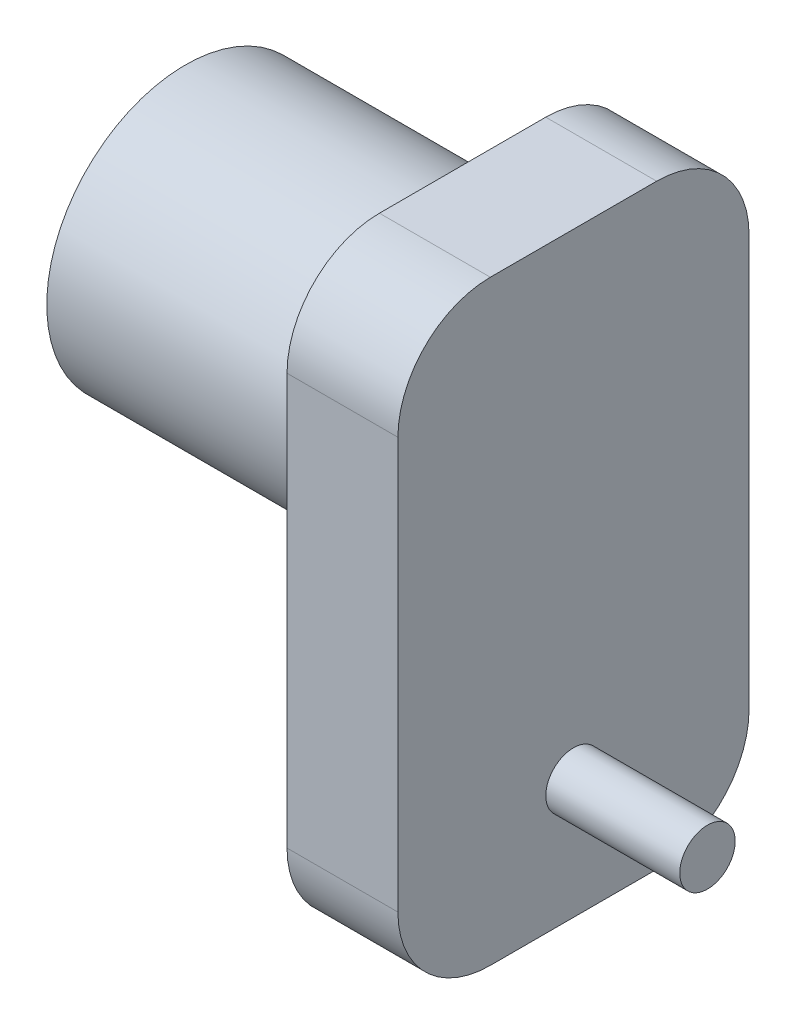
ISO-10303-21;
HEADER;
FILE_DESCRIPTION(('STEP AP214'),'2;1');
FILE_NAME('part.step','',(''),(''),'','','');
FILE_SCHEMA(('AUTOMOTIVE_DESIGN { 1 0 10303 214 1 1 1 1 }'));
ENDSEC;
DATA;
#1=APPLICATION_CONTEXT('core data for automotive mechanical design processes');
#2=APPLICATION_PROTOCOL_DEFINITION('international standard','automotive_design',2000,#1);
#3=PRODUCT_CONTEXT('',#1,'mechanical');
#4=PRODUCT('Part','Part','',(#3));
#5=PRODUCT_RELATED_PRODUCT_CATEGORY('part','',(#4));
#6=PRODUCT_DEFINITION_FORMATION('','',#4);
#7=PRODUCT_DEFINITION_CONTEXT('part definition',#1,'design');
#8=PRODUCT_DEFINITION('design','',#6,#7);
#9=PRODUCT_DEFINITION_SHAPE('','',#8);
#10=(LENGTH_UNIT() NAMED_UNIT(*) SI_UNIT(.MILLI.,.METRE.));
#11=(NAMED_UNIT(*) PLANE_ANGLE_UNIT() SI_UNIT($,.RADIAN.));
#12=(NAMED_UNIT(*) SI_UNIT($,.STERADIAN.) SOLID_ANGLE_UNIT());
#13=UNCERTAINTY_MEASURE_WITH_UNIT(LENGTH_MEASURE(1.E-05),#10,'distance_accuracy_value','');
#14=(GEOMETRIC_REPRESENTATION_CONTEXT(3) GLOBAL_UNCERTAINTY_ASSIGNED_CONTEXT((#13)) GLOBAL_UNIT_ASSIGNED_CONTEXT((#10,
#11,#12)) REPRESENTATION_CONTEXT('',''));
#15=CARTESIAN_POINT('',(0.,0.,0.));
#16=DIRECTION('',(0.,0.,1.));
#17=DIRECTION('',(1.,0.,0.));
#18=AXIS2_PLACEMENT_3D('',#15,#16,#17);
#19=CARTESIAN_POINT('',(-30.,0.,0.));
#20=DIRECTION('',(1.,0.,0.));
#21=DIRECTION('',(0.,0.,-1.));
#22=AXIS2_PLACEMENT_3D('',#19,#20,#21);
#23=CYLINDRICAL_SURFACE('',#22,15.);
#24=CARTESIAN_POINT('',(-30.,0.,0.));
#25=DIRECTION('',(1.,0.,0.));
#26=DIRECTION('',(0.,0.,-1.));
#27=AXIS2_PLACEMENT_3D('',#24,#25,#26);
#28=CIRCLE('',#27,15.);
#29=CARTESIAN_POINT('',(-30.,0.,-15.));
#30=VERTEX_POINT('',#29);
#31=EDGE_CURVE('E11',#30,#30,#28,.T.);
#32=ORIENTED_EDGE('',*,*,#31,.T.);
#33=EDGE_LOOP('',(#32));
#34=FACE_BOUND('',#33,.T.);
#35=CARTESIAN_POINT('',(0.,0.,0.));
#36=DIRECTION('',(1.,0.,0.));
#37=DIRECTION('',(0.,0.,-1.));
#38=AXIS2_PLACEMENT_3D('',#35,#36,#37);
#39=CIRCLE('',#38,15.);
#40=CARTESIAN_POINT('',(0.,0.,-15.));
#41=VERTEX_POINT('',#40);
#42=EDGE_CURVE('E37',#41,#41,#39,.T.);
#43=ORIENTED_EDGE('',*,*,#42,.F.);
#44=EDGE_LOOP('',(#43));
#45=FACE_BOUND('',#44,.T.);
#46=ADVANCED_FACE('F34',(#34,#45),#23,.T.);
#47=CARTESIAN_POINT('',(-30.,0.,0.));
#48=DIRECTION('',(1.,0.,0.));
#49=DIRECTION('',(0.,0.,-1.));
#50=AXIS2_PLACEMENT_3D('',#47,#48,#49);
#51=PLANE('',#50);
#52=ORIENTED_EDGE('',*,*,#31,.F.);
#53=EDGE_LOOP('',(#52));
#54=FACE_BOUND('',#53,.T.);
#55=ADVANCED_FACE('F211',(#54),#51,.F.);
#56=CARTESIAN_POINT('',(12.,20.6,8.99999999999993));
#57=DIRECTION('',(0.,1.,0.));
#58=DIRECTION('',(0.,0.,1.));
#59=AXIS2_PLACEMENT_3D('',#56,#57,#58);
#60=PLANE('',#59);
#61=DIRECTION('',(0.,0.,-1.));
#62=VECTOR('',#61,1.);
#63=CARTESIAN_POINT('',(0.,20.6,8.99999999999993));
#64=LINE('',#63,#62);
#65=CARTESIAN_POINT('',(0.,20.6,8.99999999999993));
#66=VERTEX_POINT('',#65);
#67=CARTESIAN_POINT('',(0.,20.6,-8.99999999999993));
#68=VERTEX_POINT('',#67);
#69=EDGE_CURVE('E134',#66,#68,#64,.T.);
#70=ORIENTED_EDGE('',*,*,#69,.F.);
#71=DIRECTION('',(-1.,0.,0.));
#72=VECTOR('',#71,1.);
#73=CARTESIAN_POINT('',(12.,20.6,8.99999999999993));
#74=LINE('',#73,#72);
#75=CARTESIAN_POINT('',(12.,20.6,8.99999999999993));
#76=VERTEX_POINT('',#75);
#77=EDGE_CURVE('E50',#76,#66,#74,.T.);
#78=ORIENTED_EDGE('',*,*,#77,.F.);
#79=DIRECTION('',(0.,0.,-1.));
#80=VECTOR('',#79,1.);
#81=CARTESIAN_POINT('',(12.,20.6,8.99999999999993));
#82=LINE('',#81,#80);
#83=CARTESIAN_POINT('',(12.,20.6,-8.99999999999993));
#84=VERTEX_POINT('',#83);
#85=EDGE_CURVE('E154',#76,#84,#82,.T.);
#86=ORIENTED_EDGE('',*,*,#85,.T.);
#87=DIRECTION('',(-1.,0.,0.));
#88=VECTOR('',#87,1.);
#89=CARTESIAN_POINT('',(12.,20.6,-8.99999999999993));
#90=LINE('',#89,#88);
#91=EDGE_CURVE('E133',#84,#68,#90,.T.);
#92=ORIENTED_EDGE('',*,*,#91,.T.);
#93=EDGE_LOOP('',(#70,#78,#86,#92));
#94=FACE_BOUND('',#93,.T.);
#95=ADVANCED_FACE('F164',(#94),#60,.T.);
#96=CARTESIAN_POINT('',(12.,10.6,9.00000000000001));
#97=DIRECTION('',(-1.,0.,0.));
#98=DIRECTION('',(0.,0.,1.));
#99=AXIS2_PLACEMENT_3D('',#96,#97,#98);
#100=CYLINDRICAL_SURFACE('',#99,10.);
#101=CARTESIAN_POINT('',(0.,10.6,9.00000000000001));
#102=DIRECTION('',(1.,0.,0.));
#103=DIRECTION('',(0.,0.,-1.));
#104=AXIS2_PLACEMENT_3D('',#101,#102,#103);
#105=CIRCLE('',#104,10.);
#106=CARTESIAN_POINT('',(0.,10.5999999999999,19.));
#107=VERTEX_POINT('',#106);
#108=EDGE_CURVE('E79',#66,#107,#105,.T.);
#109=ORIENTED_EDGE('',*,*,#108,.T.);
#110=DIRECTION('',(-1.,0.,0.));
#111=VECTOR('',#110,1.);
#112=CARTESIAN_POINT('',(12.,10.5999999999999,19.));
#113=LINE('',#112,#111);
#114=CARTESIAN_POINT('',(12.,10.5999999999999,19.));
#115=VERTEX_POINT('',#114);
#116=EDGE_CURVE('E121',#115,#107,#113,.T.);
#117=ORIENTED_EDGE('',*,*,#116,.F.);
#118=CARTESIAN_POINT('',(12.,10.6,9.00000000000001));
#119=DIRECTION('',(1.,0.,0.));
#120=DIRECTION('',(0.,0.,-1.));
#121=AXIS2_PLACEMENT_3D('',#118,#119,#120);
#122=CIRCLE('',#121,10.);
#123=EDGE_CURVE('E110',#76,#115,#122,.T.);
#124=ORIENTED_EDGE('',*,*,#123,.F.);
#125=ORIENTED_EDGE('',*,*,#77,.T.);
#126=EDGE_LOOP('',(#109,#117,#124,#125));
#127=FACE_BOUND('',#126,.T.);
#128=ADVANCED_FACE('F224',(#127),#100,.T.);
#129=CARTESIAN_POINT('',(12.,10.5999999999999,19.));
#130=DIRECTION('',(0.,0.,-1.));
#131=DIRECTION('',(0.,1.,0.));
#132=AXIS2_PLACEMENT_3D('',#129,#130,#131);
#133=PLANE('',#132);
#134=DIRECTION('',(0.,-1.,0.));
#135=VECTOR('',#134,1.);
#136=CARTESIAN_POINT('',(0.,10.5999999999999,19.));
#137=LINE('',#136,#135);
#138=CARTESIAN_POINT('',(0.,-33.8999999999999,19.));
#139=VERTEX_POINT('',#138);
#140=EDGE_CURVE('E117',#107,#139,#137,.T.);
#141=ORIENTED_EDGE('',*,*,#140,.T.);
#142=DIRECTION('',(-1.,0.,0.));
#143=VECTOR('',#142,1.);
#144=CARTESIAN_POINT('',(12.,-33.8999999999999,19.));
#145=LINE('',#144,#143);
#146=CARTESIAN_POINT('',(12.,-33.8999999999999,19.));
#147=VERTEX_POINT('',#146);
#148=EDGE_CURVE('E114',#147,#139,#145,.T.);
#149=ORIENTED_EDGE('',*,*,#148,.F.);
#150=DIRECTION('',(0.,-1.,0.));
#151=VECTOR('',#150,1.);
#152=CARTESIAN_POINT('',(12.,10.5999999999999,19.));
#153=LINE('',#152,#151);
#154=EDGE_CURVE('E105',#115,#147,#153,.T.);
#155=ORIENTED_EDGE('',*,*,#154,.F.);
#156=ORIENTED_EDGE('',*,*,#116,.T.);
#157=EDGE_LOOP('',(#141,#149,#155,#156));
#158=FACE_BOUND('',#157,.T.);
#159=ADVANCED_FACE('F115',(#158),#133,.F.);
#160=CARTESIAN_POINT('',(12.,-33.9,9.));
#161=DIRECTION('',(-1.,0.,0.));
#162=DIRECTION('',(0.,0.,1.));
#163=AXIS2_PLACEMENT_3D('',#160,#161,#162);
#164=CYLINDRICAL_SURFACE('',#163,10.);
#165=CARTESIAN_POINT('',(0.,-33.9,9.));
#166=DIRECTION('',(-1.,0.,0.));
#167=DIRECTION('',(0.,0.,1.));
#168=AXIS2_PLACEMENT_3D('',#165,#166,#167);
#169=CIRCLE('',#168,10.);
#170=CARTESIAN_POINT('',(0.,-43.9,8.99999999999993));
#171=VERTEX_POINT('',#170);
#172=EDGE_CURVE('E150',#171,#139,#169,.T.);
#173=ORIENTED_EDGE('',*,*,#172,.F.);
#174=DIRECTION('',(-1.,0.,0.));
#175=VECTOR('',#174,1.);
#176=CARTESIAN_POINT('',(12.,-43.9,8.99999999999993));
#177=LINE('',#176,#175);
#178=CARTESIAN_POINT('',(12.,-43.9,8.99999999999993));
#179=VERTEX_POINT('',#178);
#180=EDGE_CURVE('E122',#179,#171,#177,.T.);
#181=ORIENTED_EDGE('',*,*,#180,.F.);
#182=CARTESIAN_POINT('',(12.,-33.9,9.));
#183=DIRECTION('',(-1.,0.,0.));
#184=DIRECTION('',(0.,0.,1.));
#185=AXIS2_PLACEMENT_3D('',#182,#183,#184);
#186=CIRCLE('',#185,10.);
#187=EDGE_CURVE('E109',#179,#147,#186,.T.);
#188=ORIENTED_EDGE('',*,*,#187,.T.);
#189=ORIENTED_EDGE('',*,*,#148,.T.);
#190=EDGE_LOOP('',(#173,#181,#188,#189));
#191=FACE_BOUND('',#190,.T.);
#192=ADVANCED_FACE('F124',(#191),#164,.T.);
#193=CARTESIAN_POINT('',(12.,-43.9,8.99999999999993));
#194=DIRECTION('',(0.,1.,0.));
#195=DIRECTION('',(0.,0.,1.));
#196=AXIS2_PLACEMENT_3D('',#193,#194,#195);
#197=PLANE('',#196);
#198=DIRECTION('',(0.,0.,-1.));
#199=VECTOR('',#198,1.);
#200=CARTESIAN_POINT('',(0.,-43.9,8.99999999999993));
#201=LINE('',#200,#199);
#202=CARTESIAN_POINT('',(0.,-43.9,-8.99999999999993));
#203=VERTEX_POINT('',#202);
#204=EDGE_CURVE('E147',#171,#203,#201,.T.);
#205=ORIENTED_EDGE('',*,*,#204,.T.);
#206=DIRECTION('',(-1.,0.,0.));
#207=VECTOR('',#206,1.);
#208=CARTESIAN_POINT('',(12.,-43.9,-8.99999999999993));
#209=LINE('',#208,#207);
#210=CARTESIAN_POINT('',(12.,-43.9,-8.99999999999993));
#211=VERTEX_POINT('',#210);
#212=EDGE_CURVE('E158',#211,#203,#209,.T.);
#213=ORIENTED_EDGE('',*,*,#212,.F.);
#214=DIRECTION('',(0.,0.,-1.));
#215=VECTOR('',#214,1.);
#216=CARTESIAN_POINT('',(12.,-43.9,8.99999999999993));
#217=LINE('',#216,#215);
#218=EDGE_CURVE('E126',#179,#211,#217,.T.);
#219=ORIENTED_EDGE('',*,*,#218,.F.);
#220=ORIENTED_EDGE('',*,*,#180,.T.);
#221=EDGE_LOOP('',(#205,#213,#219,#220));
#222=FACE_BOUND('',#221,.T.);
#223=ADVANCED_FACE('F175',(#222),#197,.F.);
#224=CARTESIAN_POINT('',(12.,-33.9,-9.));
#225=DIRECTION('',(-1.,0.,0.));
#226=DIRECTION('',(0.,0.,1.));
#227=AXIS2_PLACEMENT_3D('',#224,#225,#226);
#228=CYLINDRICAL_SURFACE('',#227,10.);
#229=CARTESIAN_POINT('',(0.,-33.9,-9.));
#230=DIRECTION('',(-1.,0.,0.));
#231=DIRECTION('',(0.,0.,1.));
#232=AXIS2_PLACEMENT_3D('',#229,#230,#231);
#233=CIRCLE('',#232,10.);
#234=CARTESIAN_POINT('',(0.,-33.8999999999999,-19.));
#235=VERTEX_POINT('',#234);
#236=EDGE_CURVE('E144',#235,#203,#233,.T.);
#237=ORIENTED_EDGE('',*,*,#236,.F.);
#238=DIRECTION('',(-1.,0.,0.));
#239=VECTOR('',#238,1.);
#240=CARTESIAN_POINT('',(12.,-33.8999999999999,-19.));
#241=LINE('',#240,#239);
#242=CARTESIAN_POINT('',(12.,-33.8999999999999,-19.));
#243=VERTEX_POINT('',#242);
#244=EDGE_CURVE('E160',#243,#235,#241,.T.);
#245=ORIENTED_EDGE('',*,*,#244,.F.);
#246=CARTESIAN_POINT('',(12.,-33.9,-9.));
#247=DIRECTION('',(-1.,0.,0.));
#248=DIRECTION('',(0.,0.,1.));
#249=AXIS2_PLACEMENT_3D('',#246,#247,#248);
#250=CIRCLE('',#249,10.);
#251=EDGE_CURVE('E128',#243,#211,#250,.T.);
#252=ORIENTED_EDGE('',*,*,#251,.T.);
#253=ORIENTED_EDGE('',*,*,#212,.T.);
#254=EDGE_LOOP('',(#237,#245,#252,#253));
#255=FACE_BOUND('',#254,.T.);
#256=ADVANCED_FACE('F229',(#255),#228,.T.);
#257=CARTESIAN_POINT('',(12.,10.5999999999999,-19.));
#258=DIRECTION('',(0.,0.,-1.));
#259=DIRECTION('',(0.,1.,0.));
#260=AXIS2_PLACEMENT_3D('',#257,#258,#259);
#261=PLANE('',#260);
#262=DIRECTION('',(0.,-1.,0.));
#263=VECTOR('',#262,1.);
#264=CARTESIAN_POINT('',(0.,10.5999999999999,-19.));
#265=LINE('',#264,#263);
#266=CARTESIAN_POINT('',(0.,10.5999999999999,-19.));
#267=VERTEX_POINT('',#266);
#268=EDGE_CURVE('E141',#267,#235,#265,.T.);
#269=ORIENTED_EDGE('',*,*,#268,.F.);
#270=DIRECTION('',(-1.,0.,0.));
#271=VECTOR('',#270,1.);
#272=CARTESIAN_POINT('',(12.,10.5999999999999,-19.));
#273=LINE('',#272,#271);
#274=CARTESIAN_POINT('',(12.,10.5999999999999,-19.));
#275=VERTEX_POINT('',#274);
#276=EDGE_CURVE('E162',#275,#267,#273,.T.);
#277=ORIENTED_EDGE('',*,*,#276,.F.);
#278=DIRECTION('',(0.,-1.,0.));
#279=VECTOR('',#278,1.);
#280=CARTESIAN_POINT('',(12.,10.5999999999999,-19.));
#281=LINE('',#280,#279);
#282=EDGE_CURVE('E179',#275,#243,#281,.T.);
#283=ORIENTED_EDGE('',*,*,#282,.T.);
#284=ORIENTED_EDGE('',*,*,#244,.T.);
#285=EDGE_LOOP('',(#269,#277,#283,#284));
#286=FACE_BOUND('',#285,.T.);
#287=ADVANCED_FACE('F182',(#286),#261,.T.);
#288=CARTESIAN_POINT('',(12.,10.6,-9.));
#289=DIRECTION('',(-1.,0.,0.));
#290=DIRECTION('',(0.,0.,1.));
#291=AXIS2_PLACEMENT_3D('',#288,#289,#290);
#292=CYLINDRICAL_SURFACE('',#291,10.);
#293=CARTESIAN_POINT('',(0.,10.6,-9.));
#294=DIRECTION('',(1.,0.,0.));
#295=DIRECTION('',(0.,0.,-1.));
#296=AXIS2_PLACEMENT_3D('',#293,#294,#295);
#297=CIRCLE('',#296,10.);
#298=EDGE_CURVE('E137',#267,#68,#297,.T.);
#299=ORIENTED_EDGE('',*,*,#298,.T.);
#300=ORIENTED_EDGE('',*,*,#91,.F.);
#301=CARTESIAN_POINT('',(12.,10.6,-9.));
#302=DIRECTION('',(1.,0.,0.));
#303=DIRECTION('',(0.,0.,-1.));
#304=AXIS2_PLACEMENT_3D('',#301,#302,#303);
#305=CIRCLE('',#304,10.);
#306=EDGE_CURVE('E89',#275,#84,#305,.T.);
#307=ORIENTED_EDGE('',*,*,#306,.F.);
#308=ORIENTED_EDGE('',*,*,#276,.T.);
#309=EDGE_LOOP('',(#299,#300,#307,#308));
#310=FACE_BOUND('',#309,.T.);
#311=ADVANCED_FACE('F167',(#310),#292,.T.);
#312=CARTESIAN_POINT('',(12.,10.6,-9.));
#313=DIRECTION('',(1.,0.,0.));
#314=DIRECTION('',(0.,0.,-1.));
#315=AXIS2_PLACEMENT_3D('',#312,#313,#314);
#316=PLANE('',#315);
#317=CARTESIAN_POINT('',(12.,-31.,0.));
#318=DIRECTION('',(1.,0.,0.));
#319=DIRECTION('',(0.,0.,-1.));
#320=AXIS2_PLACEMENT_3D('',#317,#318,#319);
#321=CIRCLE('',#320,3.);
#322=CARTESIAN_POINT('',(12.,-31.,3.));
#323=VERTEX_POINT('',#322);
#324=EDGE_CURVE('E187',#323,#323,#321,.T.);
#325=ORIENTED_EDGE('',*,*,#324,.F.);
#326=EDGE_LOOP('',(#325));
#327=FACE_BOUND('',#326,.T.);
#328=ORIENTED_EDGE('',*,*,#85,.F.);
#329=ORIENTED_EDGE('',*,*,#123,.T.);
#330=ORIENTED_EDGE('',*,*,#154,.T.);
#331=ORIENTED_EDGE('',*,*,#187,.F.);
#332=ORIENTED_EDGE('',*,*,#218,.T.);
#333=ORIENTED_EDGE('',*,*,#251,.F.);
#334=ORIENTED_EDGE('',*,*,#282,.F.);
#335=ORIENTED_EDGE('',*,*,#306,.T.);
#336=EDGE_LOOP('',(#328,#329,#330,#331,#332,#333,#334,#335));
#337=FACE_BOUND('',#336,.T.);
#338=ADVANCED_FACE('F107',(#327,#337),#316,.T.);
#339=CARTESIAN_POINT('',(0.,10.6,-9.));
#340=DIRECTION('',(1.,0.,0.));
#341=DIRECTION('',(0.,0.,-1.));
#342=AXIS2_PLACEMENT_3D('',#339,#340,#341);
#343=PLANE('',#342);
#344=ORIENTED_EDGE('',*,*,#42,.T.);
#345=EDGE_LOOP('',(#344));
#346=FACE_BOUND('',#345,.T.);
#347=ORIENTED_EDGE('',*,*,#69,.T.);
#348=ORIENTED_EDGE('',*,*,#298,.F.);
#349=ORIENTED_EDGE('',*,*,#268,.T.);
#350=ORIENTED_EDGE('',*,*,#236,.T.);
#351=ORIENTED_EDGE('',*,*,#204,.F.);
#352=ORIENTED_EDGE('',*,*,#172,.T.);
#353=ORIENTED_EDGE('',*,*,#140,.F.);
#354=ORIENTED_EDGE('',*,*,#108,.F.);
#355=EDGE_LOOP('',(#347,#348,#349,#350,#351,#352,#353,#354));
#356=FACE_BOUND('',#355,.T.);
#357=ADVANCED_FACE('F170',(#346,#356),#343,.F.);
#358=CARTESIAN_POINT('',(26.5,-31.,0.));
#359=DIRECTION('',(-1.,0.,0.));
#360=DIRECTION('',(0.,0.,1.));
#361=AXIS2_PLACEMENT_3D('',#358,#359,#360);
#362=CYLINDRICAL_SURFACE('',#361,3.);
#363=CARTESIAN_POINT('',(26.5,-31.,0.));
#364=DIRECTION('',(1.,0.,0.));
#365=DIRECTION('',(0.,0.,-1.));
#366=AXIS2_PLACEMENT_3D('',#363,#364,#365);
#367=CIRCLE('',#366,3.);
#368=CARTESIAN_POINT('',(26.5,-31.,3.));
#369=VERTEX_POINT('',#368);
#370=EDGE_CURVE('E138',#369,#369,#367,.T.);
#371=CARTESIAN_POINT('',(26.5,-31.,3.));
#372=CARTESIAN_POINT('',(26.3489583333333,-31.,3.));
#373=CARTESIAN_POINT('',(26.1979166666667,-31.,3.));
#374=CARTESIAN_POINT('',(25.8958333333333,-31.,3.));
#375=CARTESIAN_POINT('',(25.7447916666667,-31.,3.));
#376=CARTESIAN_POINT('',(25.4427083333333,-31.,3.));
#377=CARTESIAN_POINT('',(25.2916666666667,-31.,3.));
#378=CARTESIAN_POINT('',(24.9895833333333,-31.,3.));
#379=CARTESIAN_POINT('',(24.8385416666667,-31.,3.));
#380=CARTESIAN_POINT('',(24.5364583333333,-31.,3.));
#381=CARTESIAN_POINT('',(24.3854166666667,-31.,3.));
#382=CARTESIAN_POINT('',(24.0833333333333,-31.,3.));
#383=CARTESIAN_POINT('',(23.9322916666667,-31.,3.));
#384=CARTESIAN_POINT('',(23.6302083333333,-31.,3.));
#385=CARTESIAN_POINT('',(23.4791666666667,-31.,3.));
#386=CARTESIAN_POINT('',(23.1770833333333,-31.,3.));
#387=CARTESIAN_POINT('',(23.0260416666667,-31.,3.));
#388=CARTESIAN_POINT('',(22.7239583333333,-31.,3.));
#389=CARTESIAN_POINT('',(22.5729166666667,-31.,3.));
#390=CARTESIAN_POINT('',(22.2708333333333,-31.,3.));
#391=CARTESIAN_POINT('',(22.1197916666667,-31.,3.));
#392=CARTESIAN_POINT('',(21.8177083333333,-31.,3.));
#393=CARTESIAN_POINT('',(21.6666666666667,-31.,3.));
#394=CARTESIAN_POINT('',(21.3645833333333,-31.,3.));
#395=CARTESIAN_POINT('',(21.2135416666667,-31.,3.));
#396=CARTESIAN_POINT('',(20.9114583333333,-31.,3.));
#397=CARTESIAN_POINT('',(20.7604166666667,-31.,3.));
#398=CARTESIAN_POINT('',(20.4583333333333,-31.,3.));
#399=CARTESIAN_POINT('',(20.3072916666667,-31.,3.));
#400=CARTESIAN_POINT('',(20.0052083333333,-31.,3.));
#401=CARTESIAN_POINT('',(19.8541666666667,-31.,3.));
#402=CARTESIAN_POINT('',(19.5520833333333,-31.,3.));
#403=CARTESIAN_POINT('',(19.4010416666667,-31.,3.));
#404=CARTESIAN_POINT('',(19.0989583333333,-31.,3.));
#405=CARTESIAN_POINT('',(18.9479166666667,-31.,3.));
#406=CARTESIAN_POINT('',(18.6458333333333,-31.,3.));
#407=CARTESIAN_POINT('',(18.4947916666667,-31.,3.));
#408=CARTESIAN_POINT('',(18.1927083333333,-31.,3.));
#409=CARTESIAN_POINT('',(18.0416666666667,-31.,3.));
#410=CARTESIAN_POINT('',(17.7395833333333,-31.,3.));
#411=CARTESIAN_POINT('',(17.5885416666667,-31.,3.));
#412=CARTESIAN_POINT('',(17.2864583333333,-31.,3.));
#413=CARTESIAN_POINT('',(17.1354166666667,-31.,3.));
#414=CARTESIAN_POINT('',(16.8333333333333,-31.,3.));
#415=CARTESIAN_POINT('',(16.6822916666667,-31.,3.));
#416=CARTESIAN_POINT('',(16.3802083333333,-31.,3.));
#417=CARTESIAN_POINT('',(16.2291666666667,-31.,3.));
#418=CARTESIAN_POINT('',(15.9270833333333,-31.,3.));
#419=CARTESIAN_POINT('',(15.7760416666667,-31.,3.));
#420=CARTESIAN_POINT('',(15.4739583333333,-31.,3.));
#421=CARTESIAN_POINT('',(15.3229166666667,-31.,3.));
#422=CARTESIAN_POINT('',(15.0208333333333,-31.,3.));
#423=CARTESIAN_POINT('',(14.8697916666667,-31.,3.));
#424=CARTESIAN_POINT('',(14.5677083333333,-31.,3.));
#425=CARTESIAN_POINT('',(14.4166666666667,-31.,3.));
#426=CARTESIAN_POINT('',(14.1145833333333,-31.,3.));
#427=CARTESIAN_POINT('',(13.9635416666667,-31.,3.));
#428=CARTESIAN_POINT('',(13.6614583333333,-31.,3.));
#429=CARTESIAN_POINT('',(13.5104166666667,-31.,3.));
#430=CARTESIAN_POINT('',(13.2083333333333,-31.,3.));
#431=CARTESIAN_POINT('',(13.0572916666667,-31.,3.));
#432=CARTESIAN_POINT('',(12.7552083333333,-31.,3.));
#433=CARTESIAN_POINT('',(12.6041666666667,-31.,3.));
#434=CARTESIAN_POINT('',(12.3020833333333,-31.,3.));
#435=CARTESIAN_POINT('',(12.1510416666667,-31.,3.));
#436=CARTESIAN_POINT('',(12.,-31.,3.));
#437=B_SPLINE_CURVE_WITH_KNOTS('',3,(#371,#372,#373,#374,#375,#376,#377,#378,#379,#380,#381,
#382,#383,#384,#385,#386,#387,#388,#389,#390,#391,#392,#393,#394,#395,#396,#397,#398,#399,#400,
#401,#402,#403,#404,#405,#406,#407,#408,#409,#410,#411,#412,#413,#414,#415,#416,#417,#418,#419,
#420,#421,#422,#423,#424,#425,#426,#427,#428,#429,#430,#431,#432,#433,#434,#435,#436),
.UNSPECIFIED.,.F.,.F.,(4,2,2,2,2,2,2,2,2,2,2,2,2,2,2,2,2,2,2,2,2,2,2,2,2,2,2,2,2,2,2,2,4),(0.,
0.453124999999999,0.906249999999997,1.359375,1.8125,2.265625,2.71875,3.171875,3.625,4.078125,
4.53125,4.984375,5.4375,5.890625,6.34375,6.796875,7.25,7.703125,8.15625,8.609375,9.0625,
9.515625,9.96875,10.421875,10.875,11.328125,11.78125,12.234375,12.6875,13.140625,13.59375,
14.046875,14.5),.UNSPECIFIED.);
#438=EDGE_CURVE('BSEAM195',#369,#323,#437,.T.);
#439=ORIENTED_EDGE('',*,*,#370,.F.);
#440=ORIENTED_EDGE('',*,*,#324,.T.);
#441=ORIENTED_EDGE('',*,*,#438,.T.);
#442=ORIENTED_EDGE('',*,*,#438,.F.);
#443=EDGE_LOOP('',(#439,#441,#440,#442));
#444=FACE_BOUND('',#443,.T.);
#445=ADVANCED_FACE('F195',(#444),#362,.T.);
#446=CARTESIAN_POINT('',(26.5,-31.,0.));
#447=DIRECTION('',(1.,0.,0.));
#448=DIRECTION('',(0.,0.,-1.));
#449=AXIS2_PLACEMENT_3D('',#446,#447,#448);
#450=PLANE('',#449);
#451=ORIENTED_EDGE('',*,*,#370,.T.);
#452=EDGE_LOOP('',(#451));
#453=FACE_BOUND('',#452,.T.);
#454=ADVANCED_FACE('F193',(#453),#450,.T.);
#455=CLOSED_SHELL('',(#46,#55,#95,#128,#159,#192,#223,#256,#287,#311,#338,#357,#445,#454));
#456=MANIFOLD_SOLID_BREP('B2',#455);
#457=ADVANCED_BREP_SHAPE_REPRESENTATION('',(#18,#456),#14);
#458=SHAPE_DEFINITION_REPRESENTATION(#9,#457);
ENDSEC;
END-ISO-10303-21;
